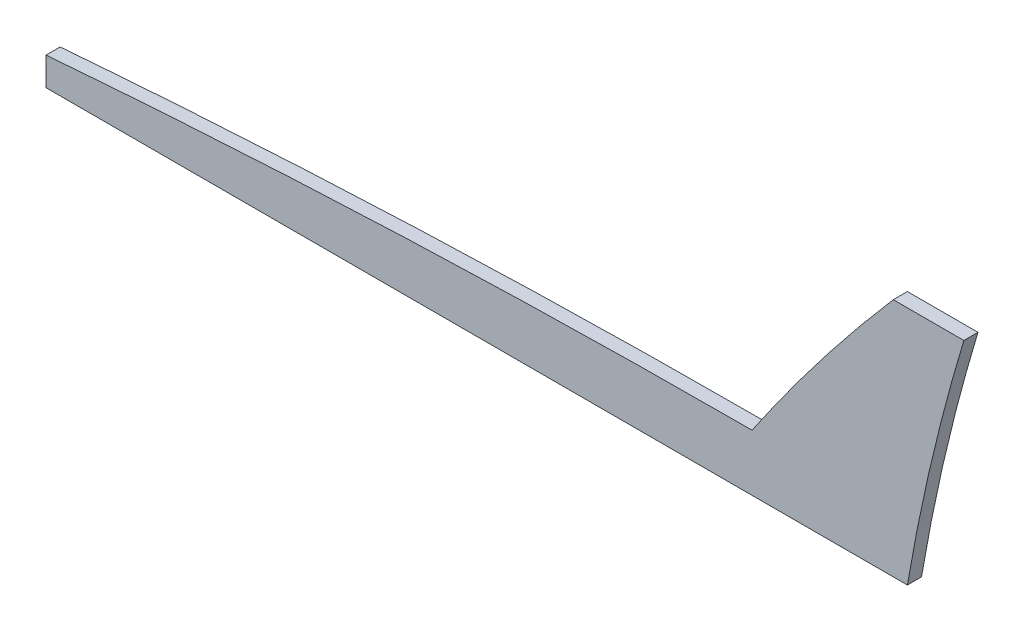
ISO-10303-21;
HEADER;
FILE_DESCRIPTION(('STEP AP214'),'2;1');
FILE_NAME('part.step','',(''),(''),'','','');
FILE_SCHEMA(('AUTOMOTIVE_DESIGN { 1 0 10303 214 1 1 1 1 }'));
ENDSEC;
DATA;
#1=APPLICATION_CONTEXT('core data for automotive mechanical design processes');
#2=APPLICATION_PROTOCOL_DEFINITION('international standard','automotive_design',2000,#1);
#3=PRODUCT_CONTEXT('',#1,'mechanical');
#4=PRODUCT('Part','Part','',(#3));
#5=PRODUCT_RELATED_PRODUCT_CATEGORY('part','',(#4));
#6=PRODUCT_DEFINITION_FORMATION('','',#4);
#7=PRODUCT_DEFINITION_CONTEXT('part definition',#1,'design');
#8=PRODUCT_DEFINITION('design','',#6,#7);
#9=PRODUCT_DEFINITION_SHAPE('','',#8);
#10=(LENGTH_UNIT() NAMED_UNIT(*) SI_UNIT(.MILLI.,.METRE.));
#11=(NAMED_UNIT(*) PLANE_ANGLE_UNIT() SI_UNIT($,.RADIAN.));
#12=(NAMED_UNIT(*) SI_UNIT($,.STERADIAN.) SOLID_ANGLE_UNIT());
#13=UNCERTAINTY_MEASURE_WITH_UNIT(LENGTH_MEASURE(1.E-05),#10,'distance_accuracy_value','');
#14=(GEOMETRIC_REPRESENTATION_CONTEXT(3) GLOBAL_UNCERTAINTY_ASSIGNED_CONTEXT((#13)) GLOBAL_UNIT_ASSIGNED_CONTEXT((#10,
#11,#12)) REPRESENTATION_CONTEXT('',''));
#15=CARTESIAN_POINT('',(0.,0.,0.));
#16=DIRECTION('',(0.,0.,1.));
#17=DIRECTION('',(1.,0.,0.));
#18=AXIS2_PLACEMENT_3D('',#15,#16,#17);
#19=CARTESIAN_POINT('',(610.,-20.,10.));
#20=CARTESIAN_POINT('',(624.457520827794,65.5607995723778,10.));
#21=CARTESIAN_POINT('',(650.,150.,10.));
#22=B_SPLINE_CURVE_WITH_KNOTS('',2,(#19,#20,#21),.UNSPECIFIED.,.F.,.F.,(3,3),(0.,1.),.UNSPECIFIED.);
#23=DIRECTION('',(0.,0.,-1.));
#24=VECTOR('',#23,1.);
#25=SURFACE_OF_LINEAR_EXTRUSION('',#22,#24);
#26=CARTESIAN_POINT('',(610.,-20.,0.));
#27=CARTESIAN_POINT('',(624.457520827794,65.5607995723778,0.));
#28=CARTESIAN_POINT('',(650.,150.,0.));
#29=B_SPLINE_CURVE_WITH_KNOTS('',2,(#26,#27,#28),.UNSPECIFIED.,.F.,.F.,(3,3),(0.,1.),.UNSPECIFIED.);
#30=CARTESIAN_POINT('',(610.,-20.,0.));
#31=VERTEX_POINT('',#30);
#32=CARTESIAN_POINT('',(650.,150.,0.));
#33=VERTEX_POINT('',#32);
#34=EDGE_CURVE('E125',#31,#33,#29,.T.);
#35=ORIENTED_EDGE('',*,*,#34,.T.);
#36=DIRECTION('',(0.,0.,-1.));
#37=VECTOR('',#36,1.);
#38=CARTESIAN_POINT('',(650.,150.,10.));
#39=LINE('',#38,#37);
#40=CARTESIAN_POINT('',(650.,150.,10.));
#41=VERTEX_POINT('',#40);
#42=EDGE_CURVE('E11',#41,#33,#39,.T.);
#43=ORIENTED_EDGE('',*,*,#42,.F.);
#44=CARTESIAN_POINT('',(610.,-20.,10.));
#45=VERTEX_POINT('',#44);
#46=EDGE_CURVE('E150',#45,#41,#22,.T.);
#47=ORIENTED_EDGE('',*,*,#46,.F.);
#48=DIRECTION('',(0.,0.,-1.));
#49=VECTOR('',#48,1.);
#50=CARTESIAN_POINT('',(610.,-20.,10.));
#51=LINE('',#50,#49);
#52=EDGE_CURVE('E118',#45,#31,#51,.T.);
#53=ORIENTED_EDGE('',*,*,#52,.T.);
#54=EDGE_LOOP('',(#35,#43,#47,#53));
#55=FACE_BOUND('',#54,.T.);
#56=ADVANCED_FACE('F37',(#55),#25,.F.);
#57=CARTESIAN_POINT('',(600.,150.,10.));
#58=DIRECTION('',(0.,-1.,0.));
#59=DIRECTION('',(0.,0.,-1.));
#60=AXIS2_PLACEMENT_3D('',#57,#58,#59);
#61=PLANE('',#60);
#62=DIRECTION('',(-1.,0.,0.));
#63=VECTOR('',#62,1.);
#64=CARTESIAN_POINT('',(600.,150.,0.));
#65=LINE('',#64,#63);
#66=CARTESIAN_POINT('',(600.,150.,0.));
#67=VERTEX_POINT('',#66);
#68=EDGE_CURVE('E130',#33,#67,#65,.T.);
#69=ORIENTED_EDGE('',*,*,#68,.T.);
#70=DIRECTION('',(0.,0.,-1.));
#71=VECTOR('',#70,1.);
#72=CARTESIAN_POINT('',(600.,150.,10.));
#73=LINE('',#72,#71);
#74=CARTESIAN_POINT('',(600.,150.,10.));
#75=VERTEX_POINT('',#74);
#76=EDGE_CURVE('E46',#75,#67,#73,.T.);
#77=ORIENTED_EDGE('',*,*,#76,.F.);
#78=DIRECTION('',(-1.,0.,0.));
#79=VECTOR('',#78,1.);
#80=CARTESIAN_POINT('',(600.,150.,10.));
#81=LINE('',#80,#79);
#82=EDGE_CURVE('E91',#41,#75,#81,.T.);
#83=ORIENTED_EDGE('',*,*,#82,.F.);
#84=ORIENTED_EDGE('',*,*,#42,.T.);
#85=EDGE_LOOP('',(#69,#77,#83,#84));
#86=FACE_BOUND('',#85,.T.);
#87=ADVANCED_FACE('F174',(#86),#61,.F.);
#88=CARTESIAN_POINT('',(600.,150.,10.));
#89=CARTESIAN_POINT('',(544.925349806326,86.3240001254146,10.));
#90=CARTESIAN_POINT('',(500.,20.0000000009236,10.));
#91=B_SPLINE_CURVE_WITH_KNOTS('',2,(#88,#89,#90),.UNSPECIFIED.,.F.,.F.,(3,3),(0.,1.),.UNSPECIFIED.);
#92=DIRECTION('',(0.,0.,-1.));
#93=VECTOR('',#92,1.);
#94=SURFACE_OF_LINEAR_EXTRUSION('',#91,#93);
#95=CARTESIAN_POINT('',(600.,150.,0.));
#96=CARTESIAN_POINT('',(544.925349806326,86.3240001254146,0.));
#97=CARTESIAN_POINT('',(500.,20.0000000009236,0.));
#98=B_SPLINE_CURVE_WITH_KNOTS('',2,(#95,#96,#97),.UNSPECIFIED.,.F.,.F.,(3,3),(0.,1.),.UNSPECIFIED.);
#99=CARTESIAN_POINT('',(500.,20.0000000009236,0.));
#100=VERTEX_POINT('',#99);
#101=EDGE_CURVE('E135',#67,#100,#98,.T.);
#102=ORIENTED_EDGE('',*,*,#101,.T.);
#103=DIRECTION('',(0.,0.,-1.));
#104=VECTOR('',#103,1.);
#105=CARTESIAN_POINT('',(500.,20.0000000009236,10.));
#106=LINE('',#105,#104);
#107=CARTESIAN_POINT('',(500.,20.0000000009236,10.));
#108=VERTEX_POINT('',#107);
#109=EDGE_CURVE('E113',#108,#100,#106,.T.);
#110=ORIENTED_EDGE('',*,*,#109,.F.);
#111=EDGE_CURVE('E104',#75,#108,#91,.T.);
#112=ORIENTED_EDGE('',*,*,#111,.F.);
#113=ORIENTED_EDGE('',*,*,#76,.T.);
#114=EDGE_LOOP('',(#102,#110,#112,#113));
#115=FACE_BOUND('',#114,.T.);
#116=ADVANCED_FACE('F156',(#115),#94,.F.);
#117=CARTESIAN_POINT('',(500.,20.0000000009236,10.));
#118=CARTESIAN_POINT('',(249.999999999978,20.0000000004633,10.));
#119=CARTESIAN_POINT('',(-6.43929354282591E-12,-5.20417042793042E-13,10.));
#120=B_SPLINE_CURVE_WITH_KNOTS('',2,(#117,#118,#119),.UNSPECIFIED.,.F.,.F.,(3,3),
(0.0831563121422956,0.916650573831121),.UNSPECIFIED.);
#121=DIRECTION('',(0.,0.,-1.));
#122=VECTOR('',#121,1.);
#123=SURFACE_OF_LINEAR_EXTRUSION('',#120,#122);
#124=CARTESIAN_POINT('',(500.,20.0000000009236,0.));
#125=CARTESIAN_POINT('',(249.999999999978,20.0000000004633,0.));
#126=CARTESIAN_POINT('',(-6.43929354282591E-12,-5.20417042793042E-13,0.));
#127=B_SPLINE_CURVE_WITH_KNOTS('',2,(#124,#125,#126),.UNSPECIFIED.,.F.,.F.,(3,3),
(0.0831563121422956,0.916650573831121),.UNSPECIFIED.);
#128=CARTESIAN_POINT('',(0.,0.,0.));
#129=VERTEX_POINT('',#128);
#130=EDGE_CURVE('E112',#100,#129,#127,.T.);
#131=ORIENTED_EDGE('',*,*,#130,.T.);
#132=DIRECTION('',(0.,0.,-1.));
#133=VECTOR('',#132,1.);
#134=CARTESIAN_POINT('',(0.,0.,10.));
#135=LINE('',#134,#133);
#136=CARTESIAN_POINT('',(0.,0.,10.));
#137=VERTEX_POINT('',#136);
#138=EDGE_CURVE('E109',#137,#129,#135,.T.);
#139=ORIENTED_EDGE('',*,*,#138,.F.);
#140=EDGE_CURVE('E98',#108,#137,#120,.T.);
#141=ORIENTED_EDGE('',*,*,#140,.F.);
#142=ORIENTED_EDGE('',*,*,#109,.T.);
#143=EDGE_LOOP('',(#131,#139,#141,#142));
#144=FACE_BOUND('',#143,.T.);
#145=ADVANCED_FACE('F110',(#144),#123,.F.);
#146=CARTESIAN_POINT('',(0.,0.,10.));
#147=DIRECTION('',(1.,0.,0.));
#148=DIRECTION('',(0.,1.,0.));
#149=AXIS2_PLACEMENT_3D('',#146,#147,#148);
#150=PLANE('',#149);
#151=DIRECTION('',(0.,-1.,0.));
#152=VECTOR('',#151,1.);
#153=CARTESIAN_POINT('',(0.,0.,0.));
#154=LINE('',#153,#152);
#155=CARTESIAN_POINT('',(0.,-20.,0.));
#156=VERTEX_POINT('',#155);
#157=EDGE_CURVE('E77',#129,#156,#154,.T.);
#158=ORIENTED_EDGE('',*,*,#157,.T.);
#159=DIRECTION('',(0.,0.,-1.));
#160=VECTOR('',#159,1.);
#161=CARTESIAN_POINT('',(0.,-20.,10.));
#162=LINE('',#161,#160);
#163=CARTESIAN_POINT('',(0.,-20.,10.));
#164=VERTEX_POINT('',#163);
#165=EDGE_CURVE('E114',#164,#156,#162,.T.);
#166=ORIENTED_EDGE('',*,*,#165,.F.);
#167=DIRECTION('',(0.,-1.,0.));
#168=VECTOR('',#167,1.);
#169=CARTESIAN_POINT('',(0.,0.,10.));
#170=LINE('',#169,#168);
#171=EDGE_CURVE('E102',#137,#164,#170,.T.);
#172=ORIENTED_EDGE('',*,*,#171,.F.);
#173=ORIENTED_EDGE('',*,*,#138,.T.);
#174=EDGE_LOOP('',(#158,#166,#172,#173));
#175=FACE_BOUND('',#174,.T.);
#176=ADVANCED_FACE('F116',(#175),#150,.F.);
#177=CARTESIAN_POINT('',(0.,-20.,10.));
#178=DIRECTION('',(0.,1.,0.));
#179=DIRECTION('',(0.,0.,1.));
#180=AXIS2_PLACEMENT_3D('',#177,#178,#179);
#181=PLANE('',#180);
#182=DIRECTION('',(1.,0.,0.));
#183=VECTOR('',#182,1.);
#184=CARTESIAN_POINT('',(0.,-20.,0.));
#185=LINE('',#184,#183);
#186=EDGE_CURVE('E83',#156,#31,#185,.T.);
#187=ORIENTED_EDGE('',*,*,#186,.T.);
#188=ORIENTED_EDGE('',*,*,#52,.F.);
#189=DIRECTION('',(1.,0.,0.));
#190=VECTOR('',#189,1.);
#191=CARTESIAN_POINT('',(0.,-20.,10.));
#192=LINE('',#191,#190);
#193=EDGE_CURVE('E54',#164,#45,#192,.T.);
#194=ORIENTED_EDGE('',*,*,#193,.F.);
#195=ORIENTED_EDGE('',*,*,#165,.T.);
#196=EDGE_LOOP('',(#187,#188,#194,#195));
#197=FACE_BOUND('',#196,.T.);
#198=ADVANCED_FACE('F163',(#197),#181,.F.);
#199=CARTESIAN_POINT('',(627.228760413897,65.2803997861889,10.));
#200=DIRECTION('',(0.,0.,1.));
#201=DIRECTION('',(1.,0.,0.));
#202=AXIS2_PLACEMENT_3D('',#199,#200,#201);
#203=PLANE('',#202);
#204=ORIENTED_EDGE('',*,*,#46,.T.);
#205=ORIENTED_EDGE('',*,*,#82,.T.);
#206=ORIENTED_EDGE('',*,*,#111,.T.);
#207=ORIENTED_EDGE('',*,*,#140,.T.);
#208=ORIENTED_EDGE('',*,*,#171,.T.);
#209=ORIENTED_EDGE('',*,*,#193,.T.);
#210=EDGE_LOOP('',(#204,#205,#206,#207,#208,#209));
#211=FACE_BOUND('',#210,.T.);
#212=ADVANCED_FACE('F100',(#211),#203,.T.);
#213=CARTESIAN_POINT('',(627.228760413897,65.2803997861889,0.));
#214=DIRECTION('',(0.,0.,1.));
#215=DIRECTION('',(1.,0.,0.));
#216=AXIS2_PLACEMENT_3D('',#213,#214,#215);
#217=PLANE('',#216);
#218=ORIENTED_EDGE('',*,*,#34,.F.);
#219=ORIENTED_EDGE('',*,*,#186,.F.);
#220=ORIENTED_EDGE('',*,*,#157,.F.);
#221=ORIENTED_EDGE('',*,*,#130,.F.);
#222=ORIENTED_EDGE('',*,*,#101,.F.);
#223=ORIENTED_EDGE('',*,*,#68,.F.);
#224=EDGE_LOOP('',(#218,#219,#220,#221,#222,#223));
#225=FACE_BOUND('',#224,.T.);
#226=ADVANCED_FACE('F159',(#225),#217,.F.);
#227=CLOSED_SHELL('',(#56,#87,#116,#145,#176,#198,#212,#226));
#228=MANIFOLD_SOLID_BREP('B2',#227);
#229=ADVANCED_BREP_SHAPE_REPRESENTATION('',(#18,#228),#14);
#230=SHAPE_DEFINITION_REPRESENTATION(#9,#229);
ENDSEC;
END-ISO-10303-21;
